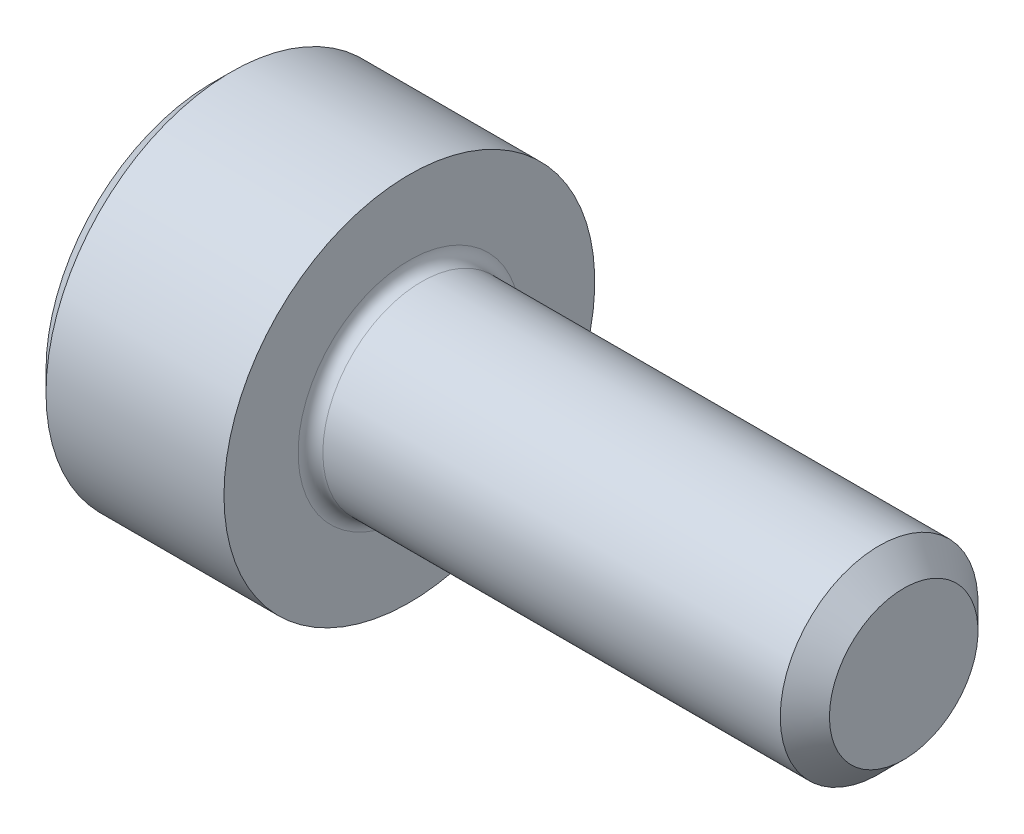
ISO-10303-21;
HEADER;
FILE_DESCRIPTION(('STEP AP214'),'2;1');
FILE_NAME('part.step','',(''),(''),'','','');
FILE_SCHEMA(('AUTOMOTIVE_DESIGN { 1 0 10303 214 1 1 1 1 }'));
ENDSEC;
DATA;
#1=APPLICATION_CONTEXT('core data for automotive mechanical design processes');
#2=APPLICATION_PROTOCOL_DEFINITION('international standard','automotive_design',2000,#1);
#3=PRODUCT_CONTEXT('',#1,'mechanical');
#4=PRODUCT('Part','Part','',(#3));
#5=PRODUCT_RELATED_PRODUCT_CATEGORY('part','',(#4));
#6=PRODUCT_DEFINITION_FORMATION('','',#4);
#7=PRODUCT_DEFINITION_CONTEXT('part definition',#1,'design');
#8=PRODUCT_DEFINITION('design','',#6,#7);
#9=PRODUCT_DEFINITION_SHAPE('','',#8);
#10=(LENGTH_UNIT() NAMED_UNIT(*) SI_UNIT(.MILLI.,.METRE.));
#11=(NAMED_UNIT(*) PLANE_ANGLE_UNIT() SI_UNIT($,.RADIAN.));
#12=(NAMED_UNIT(*) SI_UNIT($,.STERADIAN.) SOLID_ANGLE_UNIT());
#13=UNCERTAINTY_MEASURE_WITH_UNIT(LENGTH_MEASURE(1.E-05),#10,'distance_accuracy_value','');
#14=(GEOMETRIC_REPRESENTATION_CONTEXT(3) GLOBAL_UNCERTAINTY_ASSIGNED_CONTEXT((#13)) GLOBAL_UNIT_ASSIGNED_CONTEXT((#10,
#11,#12)) REPRESENTATION_CONTEXT('',''));
#15=CARTESIAN_POINT('',(0.,0.,0.));
#16=DIRECTION('',(0.,0.,1.));
#17=DIRECTION('',(1.,0.,0.));
#18=AXIS2_PLACEMENT_3D('',#15,#16,#17);
#19=CARTESIAN_POINT('',(0.,0.,0.));
#20=DIRECTION('',(-1.,0.,0.));
#21=DIRECTION('',(0.,0.,1.));
#22=AXIS2_PLACEMENT_3D('',#19,#20,#21);
#23=PLANE('',#22);
#24=DIRECTION('',(0.,-0.499999999999999,0.86602540378444));
#25=VECTOR('',#24,1.);
#26=CARTESIAN_POINT('',(0.,0.892006165897968,0.));
#27=LINE('',#26,#25);
#28=CARTESIAN_POINT('',(0.,0.892006165897968,0.));
#29=VERTEX_POINT('',#28);
#30=CARTESIAN_POINT('',(0.,0.446003082948984,0.772499999999997));
#31=VERTEX_POINT('',#30);
#32=EDGE_CURVE('E387',#29,#31,#27,.T.);
#33=ORIENTED_EDGE('',*,*,#32,.T.);
#34=DIRECTION('',(0.,1.,0.));
#35=VECTOR('',#34,1.);
#36=CARTESIAN_POINT('',(0.,-0.446003082948988,0.772499999999999));
#37=LINE('',#36,#35);
#38=CARTESIAN_POINT('',(0.,-0.446003082948988,0.772499999999999));
#39=VERTEX_POINT('',#38);
#40=EDGE_CURVE('E131',#39,#31,#37,.T.);
#41=ORIENTED_EDGE('',*,*,#40,.F.);
#42=DIRECTION('',(0.,-0.500000000000001,-0.866025403784438));
#43=VECTOR('',#42,1.);
#44=CARTESIAN_POINT('',(0.,-0.446003082948988,0.772499999999999));
#45=LINE('',#44,#43);
#46=CARTESIAN_POINT('',(0.,-0.892006165897975,0.));
#47=VERTEX_POINT('',#46);
#48=EDGE_CURVE('E390',#39,#47,#45,.T.);
#49=ORIENTED_EDGE('',*,*,#48,.T.);
#50=DIRECTION('',(0.,0.499999999999999,-0.86602540378444));
#51=VECTOR('',#50,1.);
#52=CARTESIAN_POINT('',(0.,-0.892006165897975,0.));
#53=LINE('',#52,#51);
#54=CARTESIAN_POINT('',(0.,-0.44600308294899,-0.772500000000002));
#55=VERTEX_POINT('',#54);
#56=EDGE_CURVE('E393',#47,#55,#53,.T.);
#57=ORIENTED_EDGE('',*,*,#56,.T.);
#58=DIRECTION('',(0.,-1.,0.));
#59=VECTOR('',#58,1.);
#60=CARTESIAN_POINT('',(0.,0.446003082948981,-0.772500000000003));
#61=LINE('',#60,#59);
#62=CARTESIAN_POINT('',(0.,0.446003082948981,-0.772500000000003));
#63=VERTEX_POINT('',#62);
#64=EDGE_CURVE('E396',#63,#55,#61,.T.);
#65=ORIENTED_EDGE('',*,*,#64,.F.);
#66=DIRECTION('',(0.,-0.500000000000001,-0.866025403784438));
#67=VECTOR('',#66,1.);
#68=CARTESIAN_POINT('',(0.,0.892006165897968,0.));
#69=LINE('',#68,#67);
#70=EDGE_CURVE('E126',#29,#63,#69,.T.);
#71=ORIENTED_EDGE('',*,*,#70,.F.);
#72=EDGE_LOOP('',(#33,#41,#49,#57,#65,#71));
#73=FACE_BOUND('',#72,.T.);
#74=CARTESIAN_POINT('',(0.,0.,0.));
#75=DIRECTION('',(-1.,0.,0.));
#76=DIRECTION('',(0.,0.,1.));
#77=AXIS2_PLACEMENT_3D('',#74,#75,#76);
#78=CIRCLE('',#77,1.34);
#79=CARTESIAN_POINT('',(0.,0.,1.34));
#80=VERTEX_POINT('',#79);
#81=EDGE_CURVE('E142',#80,#80,#78,.T.);
#82=ORIENTED_EDGE('',*,*,#81,.T.);
#83=EDGE_LOOP('',(#82));
#84=FACE_BOUND('',#83,.T.);
#85=ADVANCED_FACE('F35',(#73,#84),#23,.T.);
#86=CARTESIAN_POINT('',(5.6,0.601,0.));
#87=DIRECTION('',(1.,0.,0.));
#88=DIRECTION('',(0.,0.,-1.));
#89=AXIS2_PLACEMENT_3D('',#86,#87,#88);
#90=PLANE('',#89);
#91=CARTESIAN_POINT('',(5.6,0.,0.));
#92=DIRECTION('',(-1.,0.,0.));
#93=DIRECTION('',(0.,0.,1.));
#94=AXIS2_PLACEMENT_3D('',#91,#92,#93);
#95=CIRCLE('',#94,0.601);
#96=CARTESIAN_POINT('',(5.6,0.,0.601));
#97=VERTEX_POINT('',#96);
#98=EDGE_CURVE('E155',#97,#97,#95,.T.);
#99=ORIENTED_EDGE('',*,*,#98,.F.);
#100=EDGE_LOOP('',(#99));
#101=FACE_BOUND('',#100,.T.);
#102=ADVANCED_FACE('F176',(#101),#90,.T.);
#103=CARTESIAN_POINT('',(5.6,0.,0.));
#104=DIRECTION('',(-1.,0.,0.));
#105=DIRECTION('',(0.,0.,1.));
#106=AXIS2_PLACEMENT_3D('',#103,#104,#105);
#107=CONICAL_SURFACE('',#106,0.601,0.7853981633973);
#108=CARTESIAN_POINT('',(5.40099999999997,0.,0.));
#109=DIRECTION('',(-1.,0.,0.));
#110=DIRECTION('',(0.,0.,1.));
#111=AXIS2_PLACEMENT_3D('',#108,#109,#110);
#112=CIRCLE('',#111,0.799999999999966);
#113=CARTESIAN_POINT('',(5.40099999999997,0.,0.799999999999966));
#114=VERTEX_POINT('',#113);
#115=EDGE_CURVE('E152',#114,#114,#112,.T.);
#116=ORIENTED_EDGE('',*,*,#115,.F.);
#117=EDGE_LOOP('',(#116));
#118=FACE_BOUND('',#117,.T.);
#119=ORIENTED_EDGE('',*,*,#98,.T.);
#120=EDGE_LOOP('',(#119));
#121=FACE_BOUND('',#120,.T.);
#122=ADVANCED_FACE('F182',(#118,#121),#107,.T.);
#123=CARTESIAN_POINT('',(-31.75,0.,0.));
#124=DIRECTION('',(-1.,0.,0.));
#125=DIRECTION('',(0.,0.,1.));
#126=AXIS2_PLACEMENT_3D('',#123,#124,#125);
#127=CYLINDRICAL_SURFACE('',#126,0.799999999999983);
#128=CARTESIAN_POINT('',(1.7,0.,0.));
#129=DIRECTION('',(1.,0.,0.));
#130=DIRECTION('',(0.,0.,-1.));
#131=AXIS2_PLACEMENT_3D('',#128,#129,#130);
#132=CIRCLE('',#131,0.799999999999983);
#133=CARTESIAN_POINT('',(1.7,0.,-0.799999999999983));
#134=VERTEX_POINT('',#133);
#135=EDGE_CURVE('E11',#134,#134,#132,.T.);
#136=ORIENTED_EDGE('',*,*,#135,.T.);
#137=EDGE_LOOP('',(#136));
#138=FACE_BOUND('',#137,.T.);
#139=ORIENTED_EDGE('',*,*,#115,.T.);
#140=EDGE_LOOP('',(#139));
#141=FACE_BOUND('',#140,.T.);
#142=ADVANCED_FACE('F193',(#138,#141),#127,.T.);
#143=CARTESIAN_POINT('',(1.6,1.5,0.));
#144=DIRECTION('',(1.,0.,0.));
#145=DIRECTION('',(0.,0.,-1.));
#146=AXIS2_PLACEMENT_3D('',#143,#144,#145);
#147=PLANE('',#146);
#148=CARTESIAN_POINT('',(1.6,0.,0.));
#149=DIRECTION('',(1.,0.,0.));
#150=DIRECTION('',(0.,0.,-1.));
#151=AXIS2_PLACEMENT_3D('',#148,#149,#150);
#152=CIRCLE('',#151,0.899999999999983);
#153=CARTESIAN_POINT('',(1.6,0.,-0.899999999999983));
#154=VERTEX_POINT('',#153);
#155=EDGE_CURVE('E43',#154,#154,#152,.F.);
#156=ORIENTED_EDGE('',*,*,#155,.T.);
#157=EDGE_LOOP('',(#156));
#158=FACE_BOUND('',#157,.T.);
#159=CARTESIAN_POINT('',(1.6,0.,0.));
#160=DIRECTION('',(-1.,0.,0.));
#161=DIRECTION('',(0.,0.,1.));
#162=AXIS2_PLACEMENT_3D('',#159,#160,#161);
#163=CIRCLE('',#162,1.5);
#164=CARTESIAN_POINT('',(1.6,0.,1.5));
#165=VERTEX_POINT('',#164);
#166=EDGE_CURVE('E149',#165,#165,#163,.T.);
#167=ORIENTED_EDGE('',*,*,#166,.F.);
#168=EDGE_LOOP('',(#167));
#169=FACE_BOUND('',#168,.T.);
#170=ADVANCED_FACE('F160',(#158,#169),#147,.T.);
#171=CARTESIAN_POINT('',(-31.75,0.,0.));
#172=DIRECTION('',(-1.,0.,0.));
#173=DIRECTION('',(0.,0.,1.));
#174=AXIS2_PLACEMENT_3D('',#171,#172,#173);
#175=CYLINDRICAL_SURFACE('',#174,1.5);
#176=ORIENTED_EDGE('',*,*,#166,.T.);
#177=EDGE_LOOP('',(#176));
#178=FACE_BOUND('',#177,.T.);
#179=CARTESIAN_POINT('',(0.16,0.,0.));
#180=DIRECTION('',(-1.,0.,0.));
#181=DIRECTION('',(0.,0.,1.));
#182=AXIS2_PLACEMENT_3D('',#179,#180,#181);
#183=CIRCLE('',#182,1.5);
#184=CARTESIAN_POINT('',(0.16,0.,1.5));
#185=VERTEX_POINT('',#184);
#186=EDGE_CURVE('E146',#185,#185,#183,.T.);
#187=ORIENTED_EDGE('',*,*,#186,.F.);
#188=EDGE_LOOP('',(#187));
#189=FACE_BOUND('',#188,.T.);
#190=ADVANCED_FACE('F171',(#178,#189),#175,.T.);
#191=CARTESIAN_POINT('',(0.,0.,0.));
#192=DIRECTION('',(1.,0.,0.));
#193=DIRECTION('',(0.,0.,-1.));
#194=AXIS2_PLACEMENT_3D('',#191,#192,#193);
#195=CONICAL_SURFACE('',#194,1.34,0.785398163397442);
#196=ORIENTED_EDGE('',*,*,#186,.T.);
#197=EDGE_LOOP('',(#196));
#198=FACE_BOUND('',#197,.T.);
#199=ORIENTED_EDGE('',*,*,#81,.F.);
#200=EDGE_LOOP('',(#199));
#201=FACE_BOUND('',#200,.T.);
#202=ADVANCED_FACE('F164',(#198,#201),#195,.T.);
#203=CARTESIAN_POINT('',(1.7,0.,0.));
#204=DIRECTION('',(1.,0.,0.));
#205=DIRECTION('',(0.,0.,-1.));
#206=AXIS2_PLACEMENT_3D('',#203,#204,#205);
#207=TOROIDAL_SURFACE('',#206,0.899999999999983,0.1);
#208=ORIENTED_EDGE('',*,*,#135,.F.);
#209=EDGE_LOOP('',(#208));
#210=FACE_BOUND('',#209,.T.);
#211=ORIENTED_EDGE('',*,*,#155,.F.);
#212=EDGE_LOOP('',(#211));
#213=FACE_BOUND('',#212,.T.);
#214=ADVANCED_FACE('F37',(#210,#213),#207,.F.);
#215=CARTESIAN_POINT('',(0.7,0.892006165897968,0.));
#216=DIRECTION('',(0.,-0.866025403784439,-0.499999999999999));
#217=DIRECTION('',(0.,0.499999999999999,-0.866025403784439));
#218=AXIS2_PLACEMENT_3D('',#215,#216,#217);
#219=PLANE('',#218);
#220=ORIENTED_EDGE('',*,*,#32,.F.);
#221=DIRECTION('',(-1.,0.,0.));
#222=VECTOR('',#221,1.);
#223=CARTESIAN_POINT('',(0.7,0.892006165897968,0.));
#224=LINE('',#223,#222);
#225=CARTESIAN_POINT('',(0.7,0.892006165897968,0.));
#226=VERTEX_POINT('',#225);
#227=EDGE_CURVE('E377',#226,#29,#224,.T.);
#228=ORIENTED_EDGE('',*,*,#227,.F.);
#229=DIRECTION('',(0.,-0.499999999999999,0.86602540378444));
#230=VECTOR('',#229,1.);
#231=CARTESIAN_POINT('',(0.7,0.892006165897968,0.));
#232=LINE('',#231,#230);
#233=CARTESIAN_POINT('',(0.7,0.669004624423476,0.386249999999997));
#234=VERTEX_POINT('',#233);
#235=EDGE_CURVE('E118',#226,#234,#232,.T.);
#236=ORIENTED_EDGE('',*,*,#235,.T.);
#237=CARTESIAN_POINT('',(0.7,0.446003082948984,0.772499999999997));
#238=VERTEX_POINT('',#237);
#239=EDGE_CURVE('E109',#234,#238,#232,.T.);
#240=ORIENTED_EDGE('',*,*,#239,.T.);
#241=DIRECTION('',(-1.,0.,0.));
#242=VECTOR('',#241,1.);
#243=CARTESIAN_POINT('',(0.7,0.446003082948984,0.772499999999997));
#244=LINE('',#243,#242);
#245=EDGE_CURVE('E123',#238,#31,#244,.T.);
#246=ORIENTED_EDGE('',*,*,#245,.T.);
#247=EDGE_LOOP('',(#220,#228,#236,#240,#246));
#248=FACE_BOUND('',#247,.T.);
#249=ADVANCED_FACE('F122',(#248),#219,.T.);
#250=CARTESIAN_POINT('',(0.7,-0.446003082948988,0.772499999999999));
#251=DIRECTION('',(0.,0.,1.));
#252=DIRECTION('',(0.,-1.,0.));
#253=AXIS2_PLACEMENT_3D('',#250,#251,#252);
#254=PLANE('',#253);
#255=ORIENTED_EDGE('',*,*,#40,.T.);
#256=ORIENTED_EDGE('',*,*,#245,.F.);
#257=DIRECTION('',(0.,1.,0.));
#258=VECTOR('',#257,1.);
#259=CARTESIAN_POINT('',(0.7,-0.446003082948988,0.772499999999999));
#260=LINE('',#259,#258);
#261=CARTESIAN_POINT('',(0.7,0.,0.772499999999998));
#262=VERTEX_POINT('',#261);
#263=EDGE_CURVE('E106',#262,#238,#260,.T.);
#264=ORIENTED_EDGE('',*,*,#263,.F.);
#265=CARTESIAN_POINT('',(0.7,-0.446003082948988,0.772499999999999));
#266=VERTEX_POINT('',#265);
#267=EDGE_CURVE('E117',#266,#262,#260,.T.);
#268=ORIENTED_EDGE('',*,*,#267,.F.);
#269=DIRECTION('',(-1.,0.,0.));
#270=VECTOR('',#269,1.);
#271=CARTESIAN_POINT('',(0.7,-0.446003082948988,0.772499999999999));
#272=LINE('',#271,#270);
#273=EDGE_CURVE('E133',#266,#39,#272,.T.);
#274=ORIENTED_EDGE('',*,*,#273,.T.);
#275=EDGE_LOOP('',(#255,#256,#264,#268,#274));
#276=FACE_BOUND('',#275,.T.);
#277=ADVANCED_FACE('F128',(#276),#254,.F.);
#278=CARTESIAN_POINT('',(0.7,-0.446003082948988,0.772499999999999));
#279=DIRECTION('',(0.,0.866025403784438,-0.500000000000001));
#280=DIRECTION('',(0.,0.500000000000001,0.866025403784438));
#281=AXIS2_PLACEMENT_3D('',#278,#279,#280);
#282=PLANE('',#281);
#283=ORIENTED_EDGE('',*,*,#48,.F.);
#284=ORIENTED_EDGE('',*,*,#273,.F.);
#285=DIRECTION('',(0.,-0.500000000000001,-0.866025403784438));
#286=VECTOR('',#285,1.);
#287=CARTESIAN_POINT('',(0.7,-0.446003082948988,0.772499999999999));
#288=LINE('',#287,#286);
#289=CARTESIAN_POINT('',(0.7,-0.66900462442348,0.386250000000001));
#290=VERTEX_POINT('',#289);
#291=EDGE_CURVE('E416',#266,#290,#288,.T.);
#292=ORIENTED_EDGE('',*,*,#291,.T.);
#293=CARTESIAN_POINT('',(0.7,-0.892006165897975,0.));
#294=VERTEX_POINT('',#293);
#295=EDGE_CURVE('E405',#290,#294,#288,.T.);
#296=ORIENTED_EDGE('',*,*,#295,.T.);
#297=DIRECTION('',(-1.,0.,0.));
#298=VECTOR('',#297,1.);
#299=CARTESIAN_POINT('',(0.7,-0.892006165897975,0.));
#300=LINE('',#299,#298);
#301=EDGE_CURVE('E138',#294,#47,#300,.T.);
#302=ORIENTED_EDGE('',*,*,#301,.T.);
#303=EDGE_LOOP('',(#283,#284,#292,#296,#302));
#304=FACE_BOUND('',#303,.T.);
#305=ADVANCED_FACE('F268',(#304),#282,.T.);
#306=CARTESIAN_POINT('',(0.7,-0.892006165897975,0.));
#307=DIRECTION('',(0.,0.866025403784439,0.499999999999999));
#308=DIRECTION('',(0.,-0.499999999999999,0.866025403784439));
#309=AXIS2_PLACEMENT_3D('',#306,#307,#308);
#310=PLANE('',#309);
#311=ORIENTED_EDGE('',*,*,#56,.F.);
#312=ORIENTED_EDGE('',*,*,#301,.F.);
#313=DIRECTION('',(0.,0.499999999999999,-0.86602540378444));
#314=VECTOR('',#313,1.);
#315=CARTESIAN_POINT('',(0.7,-0.892006165897975,0.));
#316=LINE('',#315,#314);
#317=CARTESIAN_POINT('',(0.7,-0.669004624423483,-0.386250000000001));
#318=VERTEX_POINT('',#317);
#319=EDGE_CURVE('E383',#294,#318,#316,.T.);
#320=ORIENTED_EDGE('',*,*,#319,.T.);
#321=CARTESIAN_POINT('',(0.7,-0.44600308294899,-0.772500000000002));
#322=VERTEX_POINT('',#321);
#323=EDGE_CURVE('E415',#318,#322,#316,.T.);
#324=ORIENTED_EDGE('',*,*,#323,.T.);
#325=DIRECTION('',(-1.,0.,0.));
#326=VECTOR('',#325,1.);
#327=CARTESIAN_POINT('',(0.7,-0.44600308294899,-0.772500000000002));
#328=LINE('',#327,#326);
#329=EDGE_CURVE('E376',#322,#55,#328,.T.);
#330=ORIENTED_EDGE('',*,*,#329,.T.);
#331=EDGE_LOOP('',(#311,#312,#320,#324,#330));
#332=FACE_BOUND('',#331,.T.);
#333=ADVANCED_FACE('F276',(#332),#310,.T.);
#334=CARTESIAN_POINT('',(0.7,0.446003082948981,-0.772500000000003));
#335=DIRECTION('',(0.,0.,-1.));
#336=DIRECTION('',(0.,1.,0.));
#337=AXIS2_PLACEMENT_3D('',#334,#335,#336);
#338=PLANE('',#337);
#339=ORIENTED_EDGE('',*,*,#64,.T.);
#340=ORIENTED_EDGE('',*,*,#329,.F.);
#341=DIRECTION('',(0.,-1.,0.));
#342=VECTOR('',#341,1.);
#343=CARTESIAN_POINT('',(0.7,0.446003082948981,-0.772500000000003));
#344=LINE('',#343,#342);
#345=CARTESIAN_POINT('',(0.699999999999997,0.,-0.7725));
#346=VERTEX_POINT('',#345);
#347=EDGE_CURVE('E380',#346,#322,#344,.T.);
#348=ORIENTED_EDGE('',*,*,#347,.F.);
#349=CARTESIAN_POINT('',(0.7,0.446003082948981,-0.772500000000003));
#350=VERTEX_POINT('',#349);
#351=EDGE_CURVE('E50',#350,#346,#344,.T.);
#352=ORIENTED_EDGE('',*,*,#351,.F.);
#353=DIRECTION('',(-1.,0.,0.));
#354=VECTOR('',#353,1.);
#355=CARTESIAN_POINT('',(0.7,0.446003082948981,-0.772500000000003));
#356=LINE('',#355,#354);
#357=EDGE_CURVE('E373',#350,#63,#356,.T.);
#358=ORIENTED_EDGE('',*,*,#357,.T.);
#359=EDGE_LOOP('',(#339,#340,#348,#352,#358));
#360=FACE_BOUND('',#359,.T.);
#361=ADVANCED_FACE('F285',(#360),#338,.F.);
#362=CARTESIAN_POINT('',(0.7,0.892006165897968,0.));
#363=DIRECTION('',(0.,0.866025403784438,-0.500000000000001));
#364=DIRECTION('',(0.,0.500000000000001,0.866025403784438));
#365=AXIS2_PLACEMENT_3D('',#362,#363,#364);
#366=PLANE('',#365);
#367=ORIENTED_EDGE('',*,*,#70,.T.);
#368=ORIENTED_EDGE('',*,*,#357,.F.);
#369=DIRECTION('',(0.,-0.500000000000001,-0.866025403784438));
#370=VECTOR('',#369,1.);
#371=CARTESIAN_POINT('',(0.7,0.892006165897968,0.));
#372=LINE('',#371,#370);
#373=CARTESIAN_POINT('',(0.7,0.669004624423477,-0.38625));
#374=VERTEX_POINT('',#373);
#375=EDGE_CURVE('E363',#374,#350,#372,.T.);
#376=ORIENTED_EDGE('',*,*,#375,.F.);
#377=EDGE_CURVE('E369',#226,#374,#372,.T.);
#378=ORIENTED_EDGE('',*,*,#377,.F.);
#379=ORIENTED_EDGE('',*,*,#227,.T.);
#380=EDGE_LOOP('',(#367,#368,#376,#378,#379));
#381=FACE_BOUND('',#380,.T.);
#382=ADVANCED_FACE('F294',(#381),#366,.F.);
#383=CARTESIAN_POINT('',(0.7,1.33800924884695,-0.772500000000004));
#384=DIRECTION('',(1.,0.,0.));
#385=DIRECTION('',(0.,0.,-1.));
#386=AXIS2_PLACEMENT_3D('',#383,#384,#385);
#387=PLANE('',#386);
#388=ORIENTED_EDGE('',*,*,#347,.T.);
#389=ORIENTED_EDGE('',*,*,#323,.F.);
#390=CARTESIAN_POINT('',(0.699999999999997,0.,0.));
#391=DIRECTION('',(-1.,0.,0.));
#392=DIRECTION('',(0.,0.,1.));
#393=AXIS2_PLACEMENT_3D('',#390,#391,#392);
#394=CIRCLE('',#393,0.7725);
#395=EDGE_CURVE('E411',#346,#318,#394,.T.);
#396=ORIENTED_EDGE('',*,*,#395,.F.);
#397=EDGE_LOOP('',(#388,#389,#396));
#398=FACE_BOUND('',#397,.T.);
#399=ADVANCED_FACE('F303',(#398),#387,.F.);
#400=ORIENTED_EDGE('',*,*,#319,.F.);
#401=ORIENTED_EDGE('',*,*,#295,.F.);
#402=EDGE_CURVE('E136',#318,#290,#394,.T.);
#403=ORIENTED_EDGE('',*,*,#402,.F.);
#404=EDGE_LOOP('',(#400,#401,#403));
#405=FACE_BOUND('',#404,.T.);
#406=ADVANCED_FACE('F312',(#405),#387,.F.);
#407=ORIENTED_EDGE('',*,*,#291,.F.);
#408=ORIENTED_EDGE('',*,*,#267,.T.);
#409=EDGE_CURVE('E132',#290,#262,#394,.T.);
#410=ORIENTED_EDGE('',*,*,#409,.F.);
#411=EDGE_LOOP('',(#407,#408,#410));
#412=FACE_BOUND('',#411,.T.);
#413=ADVANCED_FACE('F321',(#412),#387,.F.);
#414=ORIENTED_EDGE('',*,*,#263,.T.);
#415=ORIENTED_EDGE('',*,*,#239,.F.);
#416=EDGE_CURVE('E112',#262,#234,#394,.T.);
#417=ORIENTED_EDGE('',*,*,#416,.F.);
#418=EDGE_LOOP('',(#414,#415,#417));
#419=FACE_BOUND('',#418,.T.);
#420=ADVANCED_FACE('F108',(#419),#387,.F.);
#421=ORIENTED_EDGE('',*,*,#235,.F.);
#422=ORIENTED_EDGE('',*,*,#377,.T.);
#423=EDGE_CURVE('E143',#234,#374,#394,.T.);
#424=ORIENTED_EDGE('',*,*,#423,.F.);
#425=EDGE_LOOP('',(#421,#422,#424));
#426=FACE_BOUND('',#425,.T.);
#427=ADVANCED_FACE('F336',(#426),#387,.F.);
#428=ORIENTED_EDGE('',*,*,#375,.T.);
#429=ORIENTED_EDGE('',*,*,#351,.T.);
#430=EDGE_CURVE('E366',#374,#346,#394,.T.);
#431=ORIENTED_EDGE('',*,*,#430,.F.);
#432=EDGE_LOOP('',(#428,#429,#431));
#433=FACE_BOUND('',#432,.T.);
#434=ADVANCED_FACE('F251',(#433),#387,.F.);
#435=CARTESIAN_POINT('',(0.699999999999997,0.,0.));
#436=DIRECTION('',(-1.,0.,0.));
#437=DIRECTION('',(0.,0.,1.));
#438=AXIS2_PLACEMENT_3D('',#435,#436,#437);
#439=CONICAL_SURFACE('',#438,0.7725,1.04719755119659);
#440=CARTESIAN_POINT('',(1.14600308294899,0.,0.));
#441=VERTEX_POINT('',#440);
#442=VERTEX_LOOP('',#441);
#443=FACE_BOUND('',#442,.T.);
#444=ORIENTED_EDGE('',*,*,#416,.T.);
#445=ORIENTED_EDGE('',*,*,#423,.T.);
#446=ORIENTED_EDGE('',*,*,#430,.T.);
#447=ORIENTED_EDGE('',*,*,#395,.T.);
#448=ORIENTED_EDGE('',*,*,#402,.T.);
#449=ORIENTED_EDGE('',*,*,#409,.T.);
#450=EDGE_LOOP('',(#444,#445,#446,#447,#448,#449));
#451=FACE_BOUND('',#450,.T.);
#452=ADVANCED_FACE('F186',(#443,#451),#439,.F.);
#453=CLOSED_SHELL('',(#85,#102,#122,#142,#170,#190,#202,#214,#249,#277,#305,#333,#361,#382,#399,
#406,#413,#420,#427,#434,#452));
#454=MANIFOLD_SOLID_BREP('B2',#453);
#455=ADVANCED_BREP_SHAPE_REPRESENTATION('',(#18,#454),#14);
#456=SHAPE_DEFINITION_REPRESENTATION(#9,#455);
ENDSEC;
END-ISO-10303-21;
